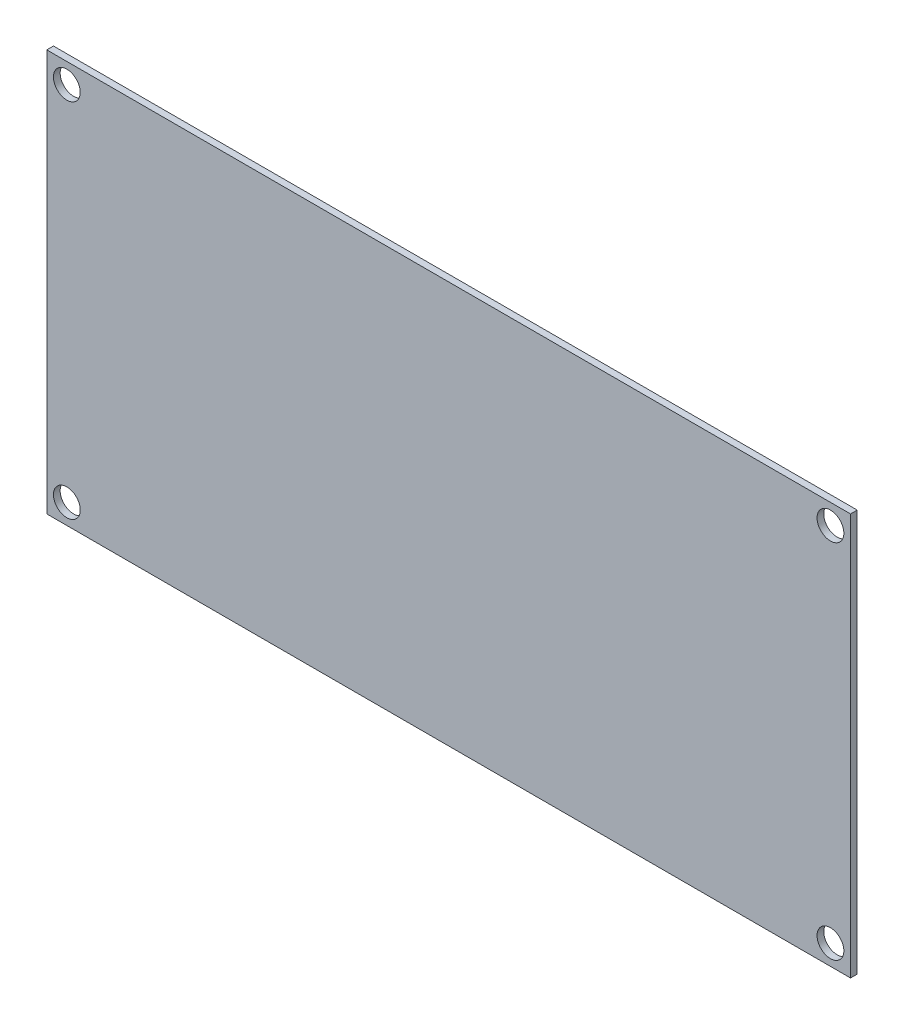
ISO-10303-21;
HEADER;
FILE_DESCRIPTION(('STEP AP214'),'2;1');
FILE_NAME('part.step','',(''),(''),'','','');
FILE_SCHEMA(('AUTOMOTIVE_DESIGN { 1 0 10303 214 1 1 1 1 }'));
ENDSEC;
DATA;
#1=APPLICATION_CONTEXT('core data for automotive mechanical design processes');
#2=APPLICATION_PROTOCOL_DEFINITION('international standard','automotive_design',2000,#1);
#3=PRODUCT_CONTEXT('',#1,'mechanical');
#4=PRODUCT('Part','Part','',(#3));
#5=PRODUCT_RELATED_PRODUCT_CATEGORY('part','',(#4));
#6=PRODUCT_DEFINITION_FORMATION('','',#4);
#7=PRODUCT_DEFINITION_CONTEXT('part definition',#1,'design');
#8=PRODUCT_DEFINITION('design','',#6,#7);
#9=PRODUCT_DEFINITION_SHAPE('','',#8);
#10=(LENGTH_UNIT() NAMED_UNIT(*) SI_UNIT(.MILLI.,.METRE.));
#11=(NAMED_UNIT(*) PLANE_ANGLE_UNIT() SI_UNIT($,.RADIAN.));
#12=(NAMED_UNIT(*) SI_UNIT($,.STERADIAN.) SOLID_ANGLE_UNIT());
#13=UNCERTAINTY_MEASURE_WITH_UNIT(LENGTH_MEASURE(1.E-05),#10,'distance_accuracy_value','');
#14=(GEOMETRIC_REPRESENTATION_CONTEXT(3) GLOBAL_UNCERTAINTY_ASSIGNED_CONTEXT((#13)) GLOBAL_UNIT_ASSIGNED_CONTEXT((#10,
#11,#12)) REPRESENTATION_CONTEXT('',''));
#15=CARTESIAN_POINT('',(0.,0.,0.));
#16=DIRECTION('',(0.,0.,1.));
#17=DIRECTION('',(1.,0.,0.));
#18=AXIS2_PLACEMENT_3D('',#15,#16,#17);
#19=CARTESIAN_POINT('',(-38.1,-19.05,0.635));
#20=DIRECTION('',(-1.,0.,0.));
#21=DIRECTION('',(0.,0.,1.));
#22=AXIS2_PLACEMENT_3D('',#19,#20,#21);
#23=PLANE('',#22);
#24=DIRECTION('',(0.,1.,0.));
#25=VECTOR('',#24,1.);
#26=CARTESIAN_POINT('',(-38.1,-19.05,0.));
#27=LINE('',#26,#25);
#28=CARTESIAN_POINT('',(-38.1,-19.05,0.));
#29=VERTEX_POINT('',#28);
#30=CARTESIAN_POINT('',(-38.1,19.05,0.));
#31=VERTEX_POINT('',#30);
#32=EDGE_CURVE('E104',#29,#31,#27,.T.);
#33=ORIENTED_EDGE('',*,*,#32,.F.);
#34=DIRECTION('',(0.,0.,-1.));
#35=VECTOR('',#34,1.);
#36=CARTESIAN_POINT('',(-38.1,-19.05,0.635));
#37=LINE('',#36,#35);
#38=CARTESIAN_POINT('',(-38.1,-19.05,0.635));
#39=VERTEX_POINT('',#38);
#40=EDGE_CURVE('E11',#39,#29,#37,.T.);
#41=ORIENTED_EDGE('',*,*,#40,.F.);
#42=DIRECTION('',(0.,1.,0.));
#43=VECTOR('',#42,1.);
#44=CARTESIAN_POINT('',(-38.1,-19.05,0.635));
#45=LINE('',#44,#43);
#46=CARTESIAN_POINT('',(-38.1,19.05,0.635));
#47=VERTEX_POINT('',#46);
#48=EDGE_CURVE('E97',#39,#47,#45,.T.);
#49=ORIENTED_EDGE('',*,*,#48,.T.);
#50=DIRECTION('',(0.,0.,-1.));
#51=VECTOR('',#50,1.);
#52=CARTESIAN_POINT('',(-38.1,19.05,0.635));
#53=LINE('',#52,#51);
#54=EDGE_CURVE('E45',#47,#31,#53,.T.);
#55=ORIENTED_EDGE('',*,*,#54,.T.);
#56=EDGE_LOOP('',(#33,#41,#49,#55));
#57=FACE_BOUND('',#56,.T.);
#58=ADVANCED_FACE('F39',(#57),#23,.T.);
#59=CARTESIAN_POINT('',(-38.1,-19.05,0.635));
#60=DIRECTION('',(0.,1.,0.));
#61=DIRECTION('',(0.,0.,1.));
#62=AXIS2_PLACEMENT_3D('',#59,#60,#61);
#63=PLANE('',#62);
#64=DIRECTION('',(1.,0.,0.));
#65=VECTOR('',#64,1.);
#66=CARTESIAN_POINT('',(-38.1,-19.05,0.));
#67=LINE('',#66,#65);
#68=CARTESIAN_POINT('',(38.1,-19.05,0.));
#69=VERTEX_POINT('',#68);
#70=EDGE_CURVE('E75',#29,#69,#67,.T.);
#71=ORIENTED_EDGE('',*,*,#70,.T.);
#72=DIRECTION('',(0.,0.,-1.));
#73=VECTOR('',#72,1.);
#74=CARTESIAN_POINT('',(38.1,-19.05,0.635));
#75=LINE('',#74,#73);
#76=CARTESIAN_POINT('',(38.1,-19.05,0.635));
#77=VERTEX_POINT('',#76);
#78=EDGE_CURVE('E48',#77,#69,#75,.T.);
#79=ORIENTED_EDGE('',*,*,#78,.F.);
#80=DIRECTION('',(1.,0.,0.));
#81=VECTOR('',#80,1.);
#82=CARTESIAN_POINT('',(-38.1,-19.05,0.635));
#83=LINE('',#82,#81);
#84=EDGE_CURVE('E90',#39,#77,#83,.T.);
#85=ORIENTED_EDGE('',*,*,#84,.F.);
#86=ORIENTED_EDGE('',*,*,#40,.T.);
#87=EDGE_LOOP('',(#71,#79,#85,#86));
#88=FACE_BOUND('',#87,.T.);
#89=ADVANCED_FACE('F118',(#88),#63,.F.);
#90=CARTESIAN_POINT('',(38.1,-19.05,0.635));
#91=DIRECTION('',(-1.,0.,0.));
#92=DIRECTION('',(0.,0.,1.));
#93=AXIS2_PLACEMENT_3D('',#90,#91,#92);
#94=PLANE('',#93);
#95=DIRECTION('',(0.,1.,0.));
#96=VECTOR('',#95,1.);
#97=CARTESIAN_POINT('',(38.1,-19.05,0.));
#98=LINE('',#97,#96);
#99=CARTESIAN_POINT('',(38.1,19.05,0.));
#100=VERTEX_POINT('',#99);
#101=EDGE_CURVE('E96',#69,#100,#98,.T.);
#102=ORIENTED_EDGE('',*,*,#101,.T.);
#103=DIRECTION('',(0.,0.,-1.));
#104=VECTOR('',#103,1.);
#105=CARTESIAN_POINT('',(38.1,19.05,0.635));
#106=LINE('',#105,#104);
#107=CARTESIAN_POINT('',(38.1,19.05,0.635));
#108=VERTEX_POINT('',#107);
#109=EDGE_CURVE('E91',#108,#100,#106,.T.);
#110=ORIENTED_EDGE('',*,*,#109,.F.);
#111=DIRECTION('',(0.,1.,0.));
#112=VECTOR('',#111,1.);
#113=CARTESIAN_POINT('',(38.1,-19.05,0.635));
#114=LINE('',#113,#112);
#115=EDGE_CURVE('E84',#77,#108,#114,.T.);
#116=ORIENTED_EDGE('',*,*,#115,.F.);
#117=ORIENTED_EDGE('',*,*,#78,.T.);
#118=EDGE_LOOP('',(#102,#110,#116,#117));
#119=FACE_BOUND('',#118,.T.);
#120=ADVANCED_FACE('F94',(#119),#94,.F.);
#121=CARTESIAN_POINT('',(-38.1,19.05,0.635));
#122=DIRECTION('',(0.,1.,0.));
#123=DIRECTION('',(0.,0.,1.));
#124=AXIS2_PLACEMENT_3D('',#121,#122,#123);
#125=PLANE('',#124);
#126=DIRECTION('',(1.,0.,0.));
#127=VECTOR('',#126,1.);
#128=CARTESIAN_POINT('',(-38.1,19.05,0.));
#129=LINE('',#128,#127);
#130=EDGE_CURVE('E107',#31,#100,#129,.T.);
#131=ORIENTED_EDGE('',*,*,#130,.F.);
#132=ORIENTED_EDGE('',*,*,#54,.F.);
#133=DIRECTION('',(1.,0.,0.));
#134=VECTOR('',#133,1.);
#135=CARTESIAN_POINT('',(-38.1,19.05,0.635));
#136=LINE('',#135,#134);
#137=EDGE_CURVE('E86',#47,#108,#136,.T.);
#138=ORIENTED_EDGE('',*,*,#137,.T.);
#139=ORIENTED_EDGE('',*,*,#109,.T.);
#140=EDGE_LOOP('',(#131,#132,#138,#139));
#141=FACE_BOUND('',#140,.T.);
#142=ADVANCED_FACE('F98',(#141),#125,.T.);
#143=CARTESIAN_POINT('',(0.,0.,0.635));
#144=DIRECTION('',(0.,0.,-1.));
#145=DIRECTION('',(-1.,0.,0.));
#146=AXIS2_PLACEMENT_3D('',#143,#144,#145);
#147=PLANE('',#146);
#148=CARTESIAN_POINT('',(36.195,17.145,0.635));
#149=DIRECTION('',(0.,0.,1.));
#150=DIRECTION('',(1.,0.,0.));
#151=AXIS2_PLACEMENT_3D('',#148,#149,#150);
#152=CIRCLE('',#151,1.27);
#153=CARTESIAN_POINT('',(37.465,17.145,0.635));
#154=VERTEX_POINT('',#153);
#155=EDGE_CURVE('E174',#154,#154,#152,.T.);
#156=ORIENTED_EDGE('',*,*,#155,.F.);
#157=EDGE_LOOP('',(#156));
#158=FACE_BOUND('',#157,.T.);
#159=CARTESIAN_POINT('',(36.195,-17.145,0.635));
#160=DIRECTION('',(0.,0.,1.));
#161=DIRECTION('',(1.,0.,0.));
#162=AXIS2_PLACEMENT_3D('',#159,#160,#161);
#163=CIRCLE('',#162,1.27);
#164=CARTESIAN_POINT('',(37.465,-17.145,0.635));
#165=VERTEX_POINT('',#164);
#166=EDGE_CURVE('E170',#165,#165,#163,.T.);
#167=ORIENTED_EDGE('',*,*,#166,.F.);
#168=EDGE_LOOP('',(#167));
#169=FACE_BOUND('',#168,.T.);
#170=CARTESIAN_POINT('',(-36.195,-17.145,0.635));
#171=DIRECTION('',(0.,0.,1.));
#172=DIRECTION('',(1.,0.,0.));
#173=AXIS2_PLACEMENT_3D('',#170,#171,#172);
#174=CIRCLE('',#173,1.27);
#175=CARTESIAN_POINT('',(-34.925,-17.145,0.635));
#176=VERTEX_POINT('',#175);
#177=EDGE_CURVE('E165',#176,#176,#174,.T.);
#178=ORIENTED_EDGE('',*,*,#177,.F.);
#179=EDGE_LOOP('',(#178));
#180=FACE_BOUND('',#179,.T.);
#181=CARTESIAN_POINT('',(-36.195,17.145,0.635));
#182=DIRECTION('',(0.,0.,1.));
#183=DIRECTION('',(1.,0.,0.));
#184=AXIS2_PLACEMENT_3D('',#181,#182,#183);
#185=CIRCLE('',#184,1.27);
#186=CARTESIAN_POINT('',(-34.925,17.145,0.635));
#187=VERTEX_POINT('',#186);
#188=EDGE_CURVE('E163',#187,#187,#185,.T.);
#189=ORIENTED_EDGE('',*,*,#188,.F.);
#190=EDGE_LOOP('',(#189));
#191=FACE_BOUND('',#190,.T.);
#192=ORIENTED_EDGE('',*,*,#48,.F.);
#193=ORIENTED_EDGE('',*,*,#84,.T.);
#194=ORIENTED_EDGE('',*,*,#115,.T.);
#195=ORIENTED_EDGE('',*,*,#137,.F.);
#196=EDGE_LOOP('',(#192,#193,#194,#195));
#197=FACE_BOUND('',#196,.T.);
#198=ADVANCED_FACE('F87',(#158,#169,#180,#191,#197),#147,.F.);
#199=CARTESIAN_POINT('',(0.,0.,0.));
#200=DIRECTION('',(0.,0.,-1.));
#201=DIRECTION('',(-1.,0.,0.));
#202=AXIS2_PLACEMENT_3D('',#199,#200,#201);
#203=PLANE('',#202);
#204=CARTESIAN_POINT('',(36.195,17.145,0.));
#205=DIRECTION('',(0.,0.,1.));
#206=DIRECTION('',(1.,0.,0.));
#207=AXIS2_PLACEMENT_3D('',#204,#205,#206);
#208=CIRCLE('',#207,1.27);
#209=CARTESIAN_POINT('',(37.465,17.145,0.));
#210=VERTEX_POINT('',#209);
#211=EDGE_CURVE('E176',#210,#210,#208,.T.);
#212=ORIENTED_EDGE('',*,*,#211,.T.);
#213=EDGE_LOOP('',(#212));
#214=FACE_BOUND('',#213,.T.);
#215=CARTESIAN_POINT('',(36.195,-17.145,0.));
#216=DIRECTION('',(0.,0.,1.));
#217=DIRECTION('',(1.,0.,0.));
#218=AXIS2_PLACEMENT_3D('',#215,#216,#217);
#219=CIRCLE('',#218,1.27);
#220=CARTESIAN_POINT('',(37.465,-17.145,0.));
#221=VERTEX_POINT('',#220);
#222=EDGE_CURVE('E175',#221,#221,#219,.T.);
#223=ORIENTED_EDGE('',*,*,#222,.T.);
#224=EDGE_LOOP('',(#223));
#225=FACE_BOUND('',#224,.T.);
#226=CARTESIAN_POINT('',(-36.195,-17.145,0.));
#227=DIRECTION('',(0.,0.,1.));
#228=DIRECTION('',(1.,0.,0.));
#229=AXIS2_PLACEMENT_3D('',#226,#227,#228);
#230=CIRCLE('',#229,1.27);
#231=CARTESIAN_POINT('',(-34.925,-17.145,0.));
#232=VERTEX_POINT('',#231);
#233=EDGE_CURVE('E157',#232,#232,#230,.T.);
#234=ORIENTED_EDGE('',*,*,#233,.T.);
#235=EDGE_LOOP('',(#234));
#236=FACE_BOUND('',#235,.T.);
#237=CARTESIAN_POINT('',(-36.195,17.145,0.));
#238=DIRECTION('',(0.,0.,1.));
#239=DIRECTION('',(1.,0.,0.));
#240=AXIS2_PLACEMENT_3D('',#237,#238,#239);
#241=CIRCLE('',#240,1.27);
#242=CARTESIAN_POINT('',(-34.925,17.145,0.));
#243=VERTEX_POINT('',#242);
#244=EDGE_CURVE('E108',#243,#243,#241,.T.);
#245=ORIENTED_EDGE('',*,*,#244,.T.);
#246=EDGE_LOOP('',(#245));
#247=FACE_BOUND('',#246,.T.);
#248=ORIENTED_EDGE('',*,*,#32,.T.);
#249=ORIENTED_EDGE('',*,*,#130,.T.);
#250=ORIENTED_EDGE('',*,*,#101,.F.);
#251=ORIENTED_EDGE('',*,*,#70,.F.);
#252=EDGE_LOOP('',(#248,#249,#250,#251));
#253=FACE_BOUND('',#252,.T.);
#254=ADVANCED_FACE('F111',(#214,#225,#236,#247,#253),#203,.T.);
#255=CARTESIAN_POINT('',(-36.195,17.145,0.));
#256=DIRECTION('',(0.,0.,1.));
#257=DIRECTION('',(1.,0.,0.));
#258=AXIS2_PLACEMENT_3D('',#255,#256,#257);
#259=CYLINDRICAL_SURFACE('',#258,1.27);
#260=ORIENTED_EDGE('',*,*,#244,.F.);
#261=EDGE_LOOP('',(#260));
#262=FACE_BOUND('',#261,.T.);
#263=ORIENTED_EDGE('',*,*,#188,.T.);
#264=EDGE_LOOP('',(#263));
#265=FACE_BOUND('',#264,.T.);
#266=ADVANCED_FACE('F134',(#262,#265),#259,.F.);
#267=CARTESIAN_POINT('',(-36.195,-17.145,0.));
#268=DIRECTION('',(0.,0.,1.));
#269=DIRECTION('',(1.,0.,0.));
#270=AXIS2_PLACEMENT_3D('',#267,#268,#269);
#271=CYLINDRICAL_SURFACE('',#270,1.27);
#272=ORIENTED_EDGE('',*,*,#233,.F.);
#273=EDGE_LOOP('',(#272));
#274=FACE_BOUND('',#273,.T.);
#275=ORIENTED_EDGE('',*,*,#177,.T.);
#276=EDGE_LOOP('',(#275));
#277=FACE_BOUND('',#276,.T.);
#278=ADVANCED_FACE('F142',(#274,#277),#271,.F.);
#279=CARTESIAN_POINT('',(36.195,-17.145,0.));
#280=DIRECTION('',(0.,0.,1.));
#281=DIRECTION('',(1.,0.,0.));
#282=AXIS2_PLACEMENT_3D('',#279,#280,#281);
#283=CYLINDRICAL_SURFACE('',#282,1.27);
#284=ORIENTED_EDGE('',*,*,#222,.F.);
#285=EDGE_LOOP('',(#284));
#286=FACE_BOUND('',#285,.T.);
#287=ORIENTED_EDGE('',*,*,#166,.T.);
#288=EDGE_LOOP('',(#287));
#289=FACE_BOUND('',#288,.T.);
#290=ADVANCED_FACE('F150',(#286,#289),#283,.F.);
#291=CARTESIAN_POINT('',(36.195,17.145,0.));
#292=DIRECTION('',(0.,0.,1.));
#293=DIRECTION('',(1.,0.,0.));
#294=AXIS2_PLACEMENT_3D('',#291,#292,#293);
#295=CYLINDRICAL_SURFACE('',#294,1.27);
#296=ORIENTED_EDGE('',*,*,#211,.F.);
#297=EDGE_LOOP('',(#296));
#298=FACE_BOUND('',#297,.T.);
#299=ORIENTED_EDGE('',*,*,#155,.T.);
#300=EDGE_LOOP('',(#299));
#301=FACE_BOUND('',#300,.T.);
#302=ADVANCED_FACE('F145',(#298,#301),#295,.F.);
#303=CLOSED_SHELL('',(#58,#89,#120,#142,#198,#254,#266,#278,#290,#302));
#304=MANIFOLD_SOLID_BREP('B2',#303);
#305=ADVANCED_BREP_SHAPE_REPRESENTATION('',(#18,#304),#14);
#306=SHAPE_DEFINITION_REPRESENTATION(#9,#305);
ENDSEC;
END-ISO-10303-21;
